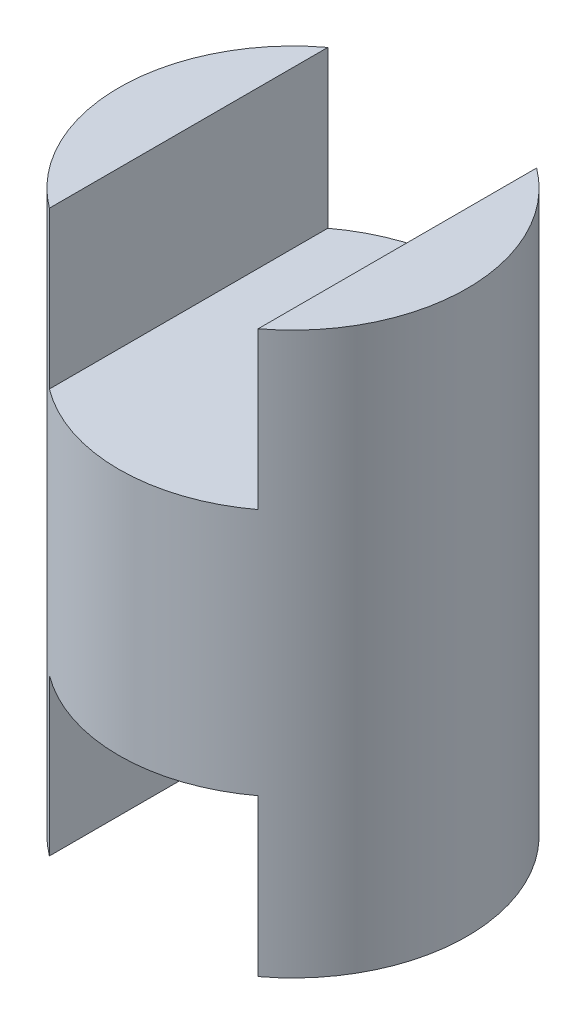
ISO-10303-21;
HEADER;
FILE_DESCRIPTION(('STEP AP214'),'2;1');
FILE_NAME('part.step','',(''),(''),'','','');
FILE_SCHEMA(('AUTOMOTIVE_DESIGN { 1 0 10303 214 1 1 1 1 }'));
ENDSEC;
DATA;
#1=APPLICATION_CONTEXT('core data for automotive mechanical design processes');
#2=APPLICATION_PROTOCOL_DEFINITION('international standard','automotive_design',2000,#1);
#3=PRODUCT_CONTEXT('',#1,'mechanical');
#4=PRODUCT('Part','Part','',(#3));
#5=PRODUCT_RELATED_PRODUCT_CATEGORY('part','',(#4));
#6=PRODUCT_DEFINITION_FORMATION('','',#4);
#7=PRODUCT_DEFINITION_CONTEXT('part definition',#1,'design');
#8=PRODUCT_DEFINITION('design','',#6,#7);
#9=PRODUCT_DEFINITION_SHAPE('','',#8);
#10=(LENGTH_UNIT() NAMED_UNIT(*) SI_UNIT(.MILLI.,.METRE.));
#11=(NAMED_UNIT(*) PLANE_ANGLE_UNIT() SI_UNIT($,.RADIAN.));
#12=(NAMED_UNIT(*) SI_UNIT($,.STERADIAN.) SOLID_ANGLE_UNIT());
#13=UNCERTAINTY_MEASURE_WITH_UNIT(LENGTH_MEASURE(1.E-05),#10,'distance_accuracy_value','');
#14=(GEOMETRIC_REPRESENTATION_CONTEXT(3) GLOBAL_UNCERTAINTY_ASSIGNED_CONTEXT((#13)) GLOBAL_UNIT_ASSIGNED_CONTEXT((#10,
#11,#12)) REPRESENTATION_CONTEXT('',''));
#15=CARTESIAN_POINT('',(0.,0.,0.));
#16=DIRECTION('',(0.,0.,1.));
#17=DIRECTION('',(1.,0.,0.));
#18=AXIS2_PLACEMENT_3D('',#15,#16,#17);
#19=CARTESIAN_POINT('',(0.,0.,0.));
#20=DIRECTION('',(0.,1.,0.));
#21=DIRECTION('',(0.,0.,1.));
#22=AXIS2_PLACEMENT_3D('',#19,#20,#21);
#23=PLANE('',#22);
#24=CARTESIAN_POINT('',(0.,0.,0.));
#25=DIRECTION('',(0.,1.,0.));
#26=DIRECTION('',(0.,0.,1.));
#27=AXIS2_PLACEMENT_3D('',#24,#25,#26);
#28=CIRCLE('',#27,12.7);
#29=CARTESIAN_POINT('',(7.62,0.,10.16));
#30=VERTEX_POINT('',#29);
#31=CARTESIAN_POINT('',(7.62,0.,-10.16));
#32=VERTEX_POINT('',#31);
#33=EDGE_CURVE('E41',#30,#32,#28,.T.);
#34=ORIENTED_EDGE('',*,*,#33,.F.);
#35=DIRECTION('',(0.,0.,1.));
#36=VECTOR('',#35,1.);
#37=CARTESIAN_POINT('',(7.62,0.,10.16));
#38=LINE('',#37,#36);
#39=EDGE_CURVE('E118',#32,#30,#38,.T.);
#40=ORIENTED_EDGE('',*,*,#39,.F.);
#41=EDGE_LOOP('',(#34,#40));
#42=FACE_BOUND('',#41,.T.);
#43=ADVANCED_FACE('F37',(#42),#23,.F.);
#44=CARTESIAN_POINT('',(0.,40.9448,0.));
#45=DIRECTION('',(0.,1.,0.));
#46=DIRECTION('',(0.,0.,1.));
#47=AXIS2_PLACEMENT_3D('',#44,#45,#46);
#48=PLANE('',#47);
#49=DIRECTION('',(0.,0.,-1.));
#50=VECTOR('',#49,1.);
#51=CARTESIAN_POINT('',(7.62,40.9448,-10.16));
#52=LINE('',#51,#50);
#53=CARTESIAN_POINT('',(7.62,40.9448,10.16));
#54=VERTEX_POINT('',#53);
#55=CARTESIAN_POINT('',(7.62,40.9448,-10.16));
#56=VERTEX_POINT('',#55);
#57=EDGE_CURVE('E135',#54,#56,#52,.T.);
#58=ORIENTED_EDGE('',*,*,#57,.F.);
#59=CARTESIAN_POINT('',(0.,40.9448,0.));
#60=DIRECTION('',(0.,1.,0.));
#61=DIRECTION('',(0.,0.,1.));
#62=AXIS2_PLACEMENT_3D('',#59,#60,#61);
#63=CIRCLE('',#62,12.7);
#64=EDGE_CURVE('E11',#54,#56,#63,.T.);
#65=ORIENTED_EDGE('',*,*,#64,.T.);
#66=EDGE_LOOP('',(#58,#65));
#67=FACE_BOUND('',#66,.T.);
#68=ADVANCED_FACE('F185',(#67),#48,.T.);
#69=CARTESIAN_POINT('',(0.,40.9448,0.));
#70=DIRECTION('',(0.,-1.,0.));
#71=DIRECTION('',(0.,0.,-1.));
#72=AXIS2_PLACEMENT_3D('',#69,#70,#71);
#73=CYLINDRICAL_SURFACE('',#72,12.7);
#74=ORIENTED_EDGE('',*,*,#33,.T.);
#75=DIRECTION('',(0.,-1.,0.));
#76=VECTOR('',#75,1.);
#77=CARTESIAN_POINT('',(7.62,11.43,-10.16));
#78=LINE('',#77,#76);
#79=CARTESIAN_POINT('',(7.62,11.43,-10.16));
#80=VERTEX_POINT('',#79);
#81=EDGE_CURVE('E126',#80,#32,#78,.T.);
#82=ORIENTED_EDGE('',*,*,#81,.F.);
#83=CARTESIAN_POINT('',(0.,11.43,0.));
#84=DIRECTION('',(0.,-1.,0.));
#85=DIRECTION('',(0.,0.,-1.));
#86=AXIS2_PLACEMENT_3D('',#83,#84,#85);
#87=CIRCLE('',#86,12.7);
#88=CARTESIAN_POINT('',(-7.62,11.43,-10.16));
#89=VERTEX_POINT('',#88);
#90=EDGE_CURVE('E108',#89,#80,#87,.T.);
#91=ORIENTED_EDGE('',*,*,#90,.F.);
#92=DIRECTION('',(0.,-1.,0.));
#93=VECTOR('',#92,1.);
#94=CARTESIAN_POINT('',(-7.62,11.43,-10.16));
#95=LINE('',#94,#93);
#96=CARTESIAN_POINT('',(-7.62,0.,-10.16));
#97=VERTEX_POINT('',#96);
#98=EDGE_CURVE('E105',#89,#97,#95,.T.);
#99=ORIENTED_EDGE('',*,*,#98,.T.);
#100=CARTESIAN_POINT('',(-7.62,0.,10.16));
#101=VERTEX_POINT('',#100);
#102=EDGE_CURVE('E124',#97,#101,#28,.T.);
#103=ORIENTED_EDGE('',*,*,#102,.T.);
#104=DIRECTION('',(0.,-1.,0.));
#105=VECTOR('',#104,1.);
#106=CARTESIAN_POINT('',(-7.62,11.43,10.16));
#107=LINE('',#106,#105);
#108=CARTESIAN_POINT('',(-7.62,11.43,10.16));
#109=VERTEX_POINT('',#108);
#110=EDGE_CURVE('E53',#109,#101,#107,.T.);
#111=ORIENTED_EDGE('',*,*,#110,.F.);
#112=CARTESIAN_POINT('',(0.,11.43,0.));
#113=DIRECTION('',(0.,-1.,0.));
#114=DIRECTION('',(0.,0.,1.));
#115=AXIS2_PLACEMENT_3D('',#112,#113,#114);
#116=CIRCLE('',#115,12.7);
#117=CARTESIAN_POINT('',(7.62,11.43,10.16));
#118=VERTEX_POINT('',#117);
#119=EDGE_CURVE('E109',#118,#109,#116,.T.);
#120=ORIENTED_EDGE('',*,*,#119,.F.);
#121=DIRECTION('',(0.,-1.,0.));
#122=VECTOR('',#121,1.);
#123=CARTESIAN_POINT('',(7.62,11.43,10.16));
#124=LINE('',#123,#122);
#125=EDGE_CURVE('E145',#118,#30,#124,.T.);
#126=ORIENTED_EDGE('',*,*,#125,.T.);
#127=EDGE_LOOP('',(#74,#82,#91,#99,#103,#111,#120,#126));
#128=FACE_BOUND('',#127,.T.);
#129=CARTESIAN_POINT('',(0.,29.5148,0.));
#130=DIRECTION('',(0.,1.,0.));
#131=DIRECTION('',(0.,0.,1.));
#132=AXIS2_PLACEMENT_3D('',#129,#130,#131);
#133=CIRCLE('',#132,12.7);
#134=CARTESIAN_POINT('',(7.62,29.5148,-10.16));
#135=VERTEX_POINT('',#134);
#136=CARTESIAN_POINT('',(-7.62,29.5148,-10.16));
#137=VERTEX_POINT('',#136);
#138=EDGE_CURVE('E131',#135,#137,#133,.T.);
#139=ORIENTED_EDGE('',*,*,#138,.F.);
#140=DIRECTION('',(0.,1.,0.));
#141=VECTOR('',#140,1.);
#142=CARTESIAN_POINT('',(7.62,29.5148,-10.16));
#143=LINE('',#142,#141);
#144=EDGE_CURVE('E147',#135,#56,#143,.T.);
#145=ORIENTED_EDGE('',*,*,#144,.T.);
#146=ORIENTED_EDGE('',*,*,#64,.F.);
#147=DIRECTION('',(0.,1.,0.));
#148=VECTOR('',#147,1.);
#149=CARTESIAN_POINT('',(7.62,29.5148,10.16));
#150=LINE('',#149,#148);
#151=CARTESIAN_POINT('',(7.62,29.5148,10.16));
#152=VERTEX_POINT('',#151);
#153=EDGE_CURVE('E150',#152,#54,#150,.T.);
#154=ORIENTED_EDGE('',*,*,#153,.F.);
#155=CARTESIAN_POINT('',(0.,29.5148,0.));
#156=DIRECTION('',(0.,1.,0.));
#157=DIRECTION('',(0.,0.,1.));
#158=AXIS2_PLACEMENT_3D('',#155,#156,#157);
#159=CIRCLE('',#158,12.7);
#160=CARTESIAN_POINT('',(-7.62,29.5148,10.16));
#161=VERTEX_POINT('',#160);
#162=EDGE_CURVE('E138',#161,#152,#159,.T.);
#163=ORIENTED_EDGE('',*,*,#162,.F.);
#164=DIRECTION('',(0.,1.,0.));
#165=VECTOR('',#164,1.);
#166=CARTESIAN_POINT('',(-7.62,29.5148,10.16));
#167=LINE('',#166,#165);
#168=CARTESIAN_POINT('',(-7.62,40.9448,10.16));
#169=VERTEX_POINT('',#168);
#170=EDGE_CURVE('E152',#161,#169,#167,.T.);
#171=ORIENTED_EDGE('',*,*,#170,.T.);
#172=CARTESIAN_POINT('',(-7.62,40.9448,-10.16));
#173=VERTEX_POINT('',#172);
#174=EDGE_CURVE('E46',#173,#169,#63,.T.);
#175=ORIENTED_EDGE('',*,*,#174,.F.);
#176=DIRECTION('',(0.,1.,0.));
#177=VECTOR('',#176,1.);
#178=CARTESIAN_POINT('',(-7.62,29.5148,-10.16));
#179=LINE('',#178,#177);
#180=EDGE_CURVE('E61',#137,#173,#179,.T.);
#181=ORIENTED_EDGE('',*,*,#180,.F.);
#182=EDGE_LOOP('',(#139,#145,#146,#154,#163,#171,#175,#181));
#183=FACE_BOUND('',#182,.T.);
#184=ADVANCED_FACE('F39',(#128,#183),#73,.T.);
#185=DIRECTION('',(0.,0.,1.));
#186=VECTOR('',#185,1.);
#187=CARTESIAN_POINT('',(-7.62,40.9448,-10.16));
#188=LINE('',#187,#186);
#189=EDGE_CURVE('E143',#173,#169,#188,.T.);
#190=ORIENTED_EDGE('',*,*,#189,.F.);
#191=ORIENTED_EDGE('',*,*,#174,.T.);
#192=EDGE_LOOP('',(#190,#191));
#193=FACE_BOUND('',#192,.T.);
#194=ADVANCED_FACE('F161',(#193),#48,.T.);
#195=ORIENTED_EDGE('',*,*,#102,.F.);
#196=DIRECTION('',(0.,0.,-1.));
#197=VECTOR('',#196,1.);
#198=CARTESIAN_POINT('',(-7.62,0.,10.16));
#199=LINE('',#198,#197);
#200=EDGE_CURVE('E167',#101,#97,#199,.T.);
#201=ORIENTED_EDGE('',*,*,#200,.F.);
#202=EDGE_LOOP('',(#195,#201));
#203=FACE_BOUND('',#202,.T.);
#204=ADVANCED_FACE('F186',(#203),#23,.F.);
#205=CARTESIAN_POINT('',(7.62,29.5148,-10.16));
#206=DIRECTION('',(1.,0.,0.));
#207=DIRECTION('',(0.,0.,-1.));
#208=AXIS2_PLACEMENT_3D('',#205,#206,#207);
#209=PLANE('',#208);
#210=ORIENTED_EDGE('',*,*,#57,.T.);
#211=ORIENTED_EDGE('',*,*,#144,.F.);
#212=DIRECTION('',(0.,0.,-1.));
#213=VECTOR('',#212,1.);
#214=CARTESIAN_POINT('',(7.62,29.5148,-10.16));
#215=LINE('',#214,#213);
#216=EDGE_CURVE('E140',#152,#135,#215,.T.);
#217=ORIENTED_EDGE('',*,*,#216,.F.);
#218=ORIENTED_EDGE('',*,*,#153,.T.);
#219=EDGE_LOOP('',(#210,#211,#217,#218));
#220=FACE_BOUND('',#219,.T.);
#221=ADVANCED_FACE('F193',(#220),#209,.F.);
#222=CARTESIAN_POINT('',(-7.62,29.5148,-10.16));
#223=DIRECTION('',(-1.,0.,0.));
#224=DIRECTION('',(0.,0.,1.));
#225=AXIS2_PLACEMENT_3D('',#222,#223,#224);
#226=PLANE('',#225);
#227=ORIENTED_EDGE('',*,*,#189,.T.);
#228=ORIENTED_EDGE('',*,*,#170,.F.);
#229=DIRECTION('',(0.,0.,1.));
#230=VECTOR('',#229,1.);
#231=CARTESIAN_POINT('',(-7.62,29.5148,-10.16));
#232=LINE('',#231,#230);
#233=EDGE_CURVE('E134',#137,#161,#232,.T.);
#234=ORIENTED_EDGE('',*,*,#233,.F.);
#235=ORIENTED_EDGE('',*,*,#180,.T.);
#236=EDGE_LOOP('',(#227,#228,#234,#235));
#237=FACE_BOUND('',#236,.T.);
#238=ADVANCED_FACE('F180',(#237),#226,.F.);
#239=CARTESIAN_POINT('',(0.,29.5148,0.));
#240=DIRECTION('',(0.,1.,0.));
#241=DIRECTION('',(0.,0.,1.));
#242=AXIS2_PLACEMENT_3D('',#239,#240,#241);
#243=PLANE('',#242);
#244=ORIENTED_EDGE('',*,*,#138,.T.);
#245=ORIENTED_EDGE('',*,*,#233,.T.);
#246=ORIENTED_EDGE('',*,*,#162,.T.);
#247=ORIENTED_EDGE('',*,*,#216,.T.);
#248=EDGE_LOOP('',(#244,#245,#246,#247));
#249=FACE_BOUND('',#248,.T.);
#250=ADVANCED_FACE('F173',(#249),#243,.T.);
#251=CARTESIAN_POINT('',(7.62,11.43,10.16));
#252=DIRECTION('',(1.,0.,0.));
#253=DIRECTION('',(0.,0.,-1.));
#254=AXIS2_PLACEMENT_3D('',#251,#252,#253);
#255=PLANE('',#254);
#256=ORIENTED_EDGE('',*,*,#39,.T.);
#257=ORIENTED_EDGE('',*,*,#125,.F.);
#258=DIRECTION('',(0.,0.,1.));
#259=VECTOR('',#258,1.);
#260=CARTESIAN_POINT('',(7.62,11.43,10.16));
#261=LINE('',#260,#259);
#262=EDGE_CURVE('E115',#80,#118,#261,.T.);
#263=ORIENTED_EDGE('',*,*,#262,.F.);
#264=ORIENTED_EDGE('',*,*,#81,.T.);
#265=EDGE_LOOP('',(#256,#257,#263,#264));
#266=FACE_BOUND('',#265,.T.);
#267=ADVANCED_FACE('F171',(#266),#255,.F.);
#268=CARTESIAN_POINT('',(-7.62,11.43,10.16));
#269=DIRECTION('',(-1.,0.,0.));
#270=DIRECTION('',(0.,0.,1.));
#271=AXIS2_PLACEMENT_3D('',#268,#269,#270);
#272=PLANE('',#271);
#273=ORIENTED_EDGE('',*,*,#200,.T.);
#274=ORIENTED_EDGE('',*,*,#98,.F.);
#275=DIRECTION('',(0.,0.,-1.));
#276=VECTOR('',#275,1.);
#277=CARTESIAN_POINT('',(-7.62,11.43,10.16));
#278=LINE('',#277,#276);
#279=EDGE_CURVE('E101',#109,#89,#278,.T.);
#280=ORIENTED_EDGE('',*,*,#279,.F.);
#281=ORIENTED_EDGE('',*,*,#110,.T.);
#282=EDGE_LOOP('',(#273,#274,#280,#281));
#283=FACE_BOUND('',#282,.T.);
#284=ADVANCED_FACE('F103',(#283),#272,.F.);
#285=CARTESIAN_POINT('',(0.,11.43,0.));
#286=DIRECTION('',(0.,1.,0.));
#287=DIRECTION('',(0.,0.,1.));
#288=AXIS2_PLACEMENT_3D('',#285,#286,#287);
#289=PLANE('',#288);
#290=ORIENTED_EDGE('',*,*,#119,.T.);
#291=ORIENTED_EDGE('',*,*,#279,.T.);
#292=ORIENTED_EDGE('',*,*,#90,.T.);
#293=ORIENTED_EDGE('',*,*,#262,.T.);
#294=EDGE_LOOP('',(#290,#291,#292,#293));
#295=FACE_BOUND('',#294,.T.);
#296=ADVANCED_FACE('F113',(#295),#289,.F.);
#297=CLOSED_SHELL('',(#43,#68,#184,#194,#204,#221,#238,#250,#267,#284,#296));
#298=MANIFOLD_SOLID_BREP('B2',#297);
#299=ADVANCED_BREP_SHAPE_REPRESENTATION('',(#18,#298),#14);
#300=SHAPE_DEFINITION_REPRESENTATION(#9,#299);
ENDSEC;
END-ISO-10303-21;
